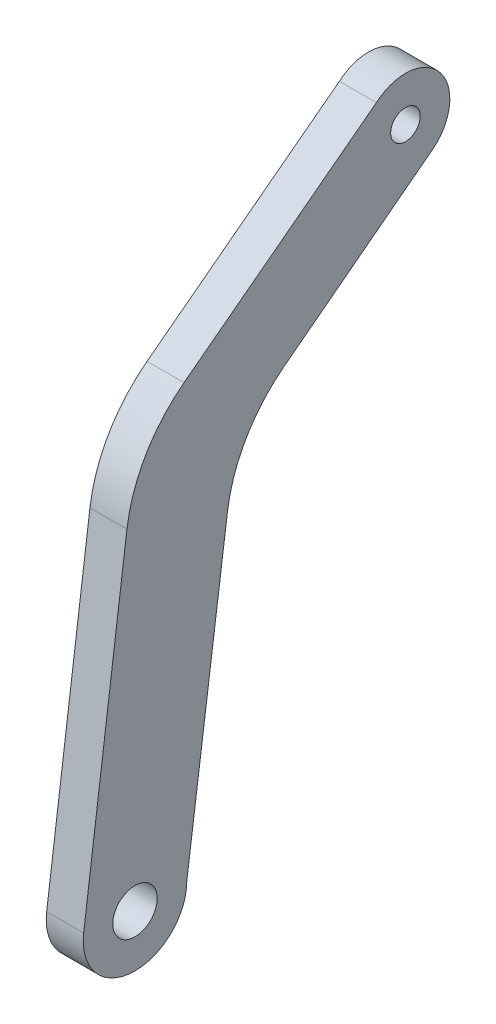
ISO-10303-21;
HEADER;
FILE_DESCRIPTION(('STEP AP214'),'2;1');
FILE_NAME('part.step','',(''),(''),'','','');
FILE_SCHEMA(('AUTOMOTIVE_DESIGN { 1 0 10303 214 1 1 1 1 }'));
ENDSEC;
DATA;
#1=APPLICATION_CONTEXT('core data for automotive mechanical design processes');
#2=APPLICATION_PROTOCOL_DEFINITION('international standard','automotive_design',2000,#1);
#3=PRODUCT_CONTEXT('',#1,'mechanical');
#4=PRODUCT('Part','Part','',(#3));
#5=PRODUCT_RELATED_PRODUCT_CATEGORY('part','',(#4));
#6=PRODUCT_DEFINITION_FORMATION('','',#4);
#7=PRODUCT_DEFINITION_CONTEXT('part definition',#1,'design');
#8=PRODUCT_DEFINITION('design','',#6,#7);
#9=PRODUCT_DEFINITION_SHAPE('','',#8);
#10=(LENGTH_UNIT() NAMED_UNIT(*) SI_UNIT(.MILLI.,.METRE.));
#11=(NAMED_UNIT(*) PLANE_ANGLE_UNIT() SI_UNIT($,.RADIAN.));
#12=(NAMED_UNIT(*) SI_UNIT($,.STERADIAN.) SOLID_ANGLE_UNIT());
#13=UNCERTAINTY_MEASURE_WITH_UNIT(LENGTH_MEASURE(1.E-05),#10,'distance_accuracy_value','');
#14=(GEOMETRIC_REPRESENTATION_CONTEXT(3) GLOBAL_UNCERTAINTY_ASSIGNED_CONTEXT((#13)) GLOBAL_UNIT_ASSIGNED_CONTEXT((#10,
#11,#12)) REPRESENTATION_CONTEXT('',''));
#15=CARTESIAN_POINT('',(0.,0.,0.));
#16=DIRECTION('',(0.,0.,1.));
#17=DIRECTION('',(1.,0.,0.));
#18=AXIS2_PLACEMENT_3D('',#15,#16,#17);
#19=CARTESIAN_POINT('',(5.,-32.6640399264904,0.313917813184128));
#20=DIRECTION('',(1.,0.,0.));
#21=DIRECTION('',(0.,0.,-1.));
#22=AXIS2_PLACEMENT_3D('',#19,#20,#21);
#23=PLANE('',#22);
#24=CARTESIAN_POINT('',(5.,3.32452453756496,-3.92901319278749));
#25=DIRECTION('',(1.,0.,0.));
#26=DIRECTION('',(0.,0.,-1.));
#27=AXIS2_PLACEMENT_3D('',#24,#25,#26);
#28=CIRCLE('',#27,2.00000000000453);
#29=CARTESIAN_POINT('',(5.,3.32452453756496,-5.92901319279202));
#30=VERTEX_POINT('',#29);
#31=EDGE_CURVE('E133',#30,#30,#28,.T.);
#32=ORIENTED_EDGE('',*,*,#31,.F.);
#33=EDGE_LOOP('',(#32));
#34=FACE_BOUND('',#33,.T.);
#35=CARTESIAN_POINT('',(5.,-32.6640399264904,0.313917813184128));
#36=DIRECTION('',(-1.,0.,0.));
#37=DIRECTION('',(0.,0.,-1.));
#38=AXIS2_PLACEMENT_3D('',#35,#36,#37);
#39=CIRCLE('',#38,20.);
#40=CARTESIAN_POINT('',(5.,-29.9728266834477,20.1320249700362));
#41=VERTEX_POINT('',#40);
#42=CARTESIAN_POINT('',(5.,-16.781905188058,12.469484280868));
#43=VERTEX_POINT('',#42);
#44=EDGE_CURVE('E144',#41,#43,#39,.T.);
#45=ORIENTED_EDGE('',*,*,#44,.T.);
#46=DIRECTION('',(0.,0.607778323384194,-0.794106736921617));
#47=VECTOR('',#46,1.);
#48=CARTESIAN_POINT('',(5.,-1.44011588396474,-7.57568313309265));
#49=LINE('',#48,#47);
#50=CARTESIAN_POINT('',(5.,-1.44011588396474,-7.57568313309265));
#51=VERTEX_POINT('',#50);
#52=EDGE_CURVE('E92',#43,#51,#49,.T.);
#53=ORIENTED_EDGE('',*,*,#52,.T.);
#54=CARTESIAN_POINT('',(5.,3.32452453756496,-3.92901319278749));
#55=DIRECTION('',(1.,0.,0.));
#56=DIRECTION('',(0.,0.,-1.));
#57=AXIS2_PLACEMENT_3D('',#54,#55,#56);
#58=CIRCLE('',#57,6.);
#59=CARTESIAN_POINT('',(5.,7.85915300424806,6.24326979004053E-12));
#60=VERTEX_POINT('',#59);
#61=EDGE_CURVE('E159',#51,#60,#58,.T.);
#62=ORIENTED_EDGE('',*,*,#61,.T.);
#63=DIRECTION('',(0.,-0.605436172771901,0.795893862709917));
#64=VECTOR('',#63,1.);
#65=CARTESIAN_POINT('',(5.,7.85915300424806,6.24570068635597E-12));
#66=LINE('',#65,#64);
#67=CARTESIAN_POINT('',(5.,-11.9219663307615,26.0038500907374));
#68=VERTEX_POINT('',#67);
#69=EDGE_CURVE('E172',#60,#68,#66,.T.);
#70=ORIENTED_EDGE('',*,*,#69,.T.);
#71=CARTESIAN_POINT('',(5.,-27.8398435849598,13.8951266352994));
#72=DIRECTION('',(1.,0.,0.));
#73=DIRECTION('',(0.,0.,1.));
#74=AXIS2_PLACEMENT_3D('',#71,#72,#73);
#75=CIRCLE('',#74,20.);
#76=CARTESIAN_POINT('',(5.,-25.2241479210491,33.7233422936434));
#77=VERTEX_POINT('',#76);
#78=EDGE_CURVE('E111',#68,#77,#75,.T.);
#79=ORIENTED_EDGE('',*,*,#78,.T.);
#80=DIRECTION('',(0.,-0.991410782917201,0.130784783195533));
#81=VECTOR('',#80,1.);
#82=CARTESIAN_POINT('',(5.,-25.2241479210491,33.7233422936434));
#83=LINE('',#82,#81);
#84=CARTESIAN_POINT('',(5.,-69.5716897836753,39.5735748588896));
#85=VERTEX_POINT('',#84);
#86=EDGE_CURVE('E105',#77,#85,#83,.T.);
#87=ORIENTED_EDGE('',*,*,#86,.T.);
#88=CARTESIAN_POINT('',(5.,-70.487183266044,32.6336993784692));
#89=DIRECTION('',(1.,0.,0.));
#90=DIRECTION('',(0.,0.,-1.));
#91=AXIS2_PLACEMENT_3D('',#88,#89,#90);
#92=CIRCLE('',#91,7.);
#93=CARTESIAN_POINT('',(5.,-70.487183266044,25.6336993784692));
#94=VERTEX_POINT('',#93);
#95=EDGE_CURVE('E109',#85,#94,#92,.T.);
#96=ORIENTED_EDGE('',*,*,#95,.T.);
#97=DIRECTION('',(0.,0.990905357842604,-0.134560662152132));
#98=VECTOR('',#97,1.);
#99=CARTESIAN_POINT('',(5.,-29.9728266834477,20.1320249700362));
#100=LINE('',#99,#98);
#101=EDGE_CURVE('E49',#94,#41,#100,.T.);
#102=ORIENTED_EDGE('',*,*,#101,.T.);
#103=EDGE_LOOP('',(#45,#53,#62,#70,#79,#87,#96,#102));
#104=FACE_BOUND('',#103,.T.);
#105=CARTESIAN_POINT('',(5.,-70.487183266044,32.6336993784692));
#106=DIRECTION('',(1.,0.,0.));
#107=DIRECTION('',(0.,0.,-1.));
#108=AXIS2_PLACEMENT_3D('',#105,#106,#107);
#109=CIRCLE('',#108,3.0000000000013);
#110=CARTESIAN_POINT('',(5.,-70.487183266044,29.6336993784679));
#111=VERTEX_POINT('',#110);
#112=EDGE_CURVE('E181',#111,#111,#109,.T.);
#113=ORIENTED_EDGE('',*,*,#112,.F.);
#114=EDGE_LOOP('',(#113));
#115=FACE_BOUND('',#114,.T.);
#116=ADVANCED_FACE('F32',(#34,#104,#115),#23,.T.);
#117=CARTESIAN_POINT('',(0.,-32.6640399264904,0.313917813184128));
#118=DIRECTION('',(1.,0.,0.));
#119=DIRECTION('',(0.,0.,-1.));
#120=AXIS2_PLACEMENT_3D('',#117,#118,#119);
#121=PLANE('',#120);
#122=CARTESIAN_POINT('',(0.,3.32452453756496,-3.92901319278749));
#123=DIRECTION('',(1.,0.,0.));
#124=DIRECTION('',(0.,0.,-1.));
#125=AXIS2_PLACEMENT_3D('',#122,#123,#124);
#126=CIRCLE('',#125,2.00000000000453);
#127=CARTESIAN_POINT('',(0.,3.32452453756496,-5.92901319279202));
#128=VERTEX_POINT('',#127);
#129=EDGE_CURVE('E178',#128,#128,#126,.T.);
#130=ORIENTED_EDGE('',*,*,#129,.T.);
#131=EDGE_LOOP('',(#130));
#132=FACE_BOUND('',#131,.T.);
#133=CARTESIAN_POINT('',(0.,-32.6640399264904,0.313917813184128));
#134=DIRECTION('',(-1.,0.,0.));
#135=DIRECTION('',(0.,0.,-1.));
#136=AXIS2_PLACEMENT_3D('',#133,#134,#135);
#137=CIRCLE('',#136,20.);
#138=CARTESIAN_POINT('',(0.,-29.9728266834477,20.1320249700362));
#139=VERTEX_POINT('',#138);
#140=CARTESIAN_POINT('',(0.,-16.781905188058,12.469484280868));
#141=VERTEX_POINT('',#140);
#142=EDGE_CURVE('E129',#139,#141,#137,.T.);
#143=ORIENTED_EDGE('',*,*,#142,.F.);
#144=DIRECTION('',(0.,0.990905357842604,-0.134560662152132));
#145=VECTOR('',#144,1.);
#146=CARTESIAN_POINT('',(0.,-29.9728266834477,20.1320249700362));
#147=LINE('',#146,#145);
#148=CARTESIAN_POINT('',(0.,-70.487183266044,25.6336993784692));
#149=VERTEX_POINT('',#148);
#150=EDGE_CURVE('E84',#149,#139,#147,.T.);
#151=ORIENTED_EDGE('',*,*,#150,.F.);
#152=CARTESIAN_POINT('',(0.,-70.487183266044,32.6336993784692));
#153=DIRECTION('',(1.,0.,0.));
#154=DIRECTION('',(0.,0.,-1.));
#155=AXIS2_PLACEMENT_3D('',#152,#153,#154);
#156=CIRCLE('',#155,7.);
#157=CARTESIAN_POINT('',(0.,-69.5716897836753,39.5735748588896));
#158=VERTEX_POINT('',#157);
#159=EDGE_CURVE('E78',#158,#149,#156,.T.);
#160=ORIENTED_EDGE('',*,*,#159,.F.);
#161=DIRECTION('',(0.,-0.991410782917201,0.130784783195533));
#162=VECTOR('',#161,1.);
#163=CARTESIAN_POINT('',(0.,-25.2241479210491,33.7233422936434));
#164=LINE('',#163,#162);
#165=CARTESIAN_POINT('',(0.,-25.2241479210491,33.7233422936434));
#166=VERTEX_POINT('',#165);
#167=EDGE_CURVE('E119',#166,#158,#164,.T.);
#168=ORIENTED_EDGE('',*,*,#167,.F.);
#169=CARTESIAN_POINT('',(0.,-27.8398435849598,13.8951266352994));
#170=DIRECTION('',(1.,0.,0.));
#171=DIRECTION('',(0.,0.,1.));
#172=AXIS2_PLACEMENT_3D('',#169,#170,#171);
#173=CIRCLE('',#172,20.);
#174=CARTESIAN_POINT('',(0.,-11.9219663307615,26.0038500907374));
#175=VERTEX_POINT('',#174);
#176=EDGE_CURVE('E139',#175,#166,#173,.T.);
#177=ORIENTED_EDGE('',*,*,#176,.F.);
#178=DIRECTION('',(0.,-0.605436172771901,0.795893862709917));
#179=VECTOR('',#178,1.);
#180=CARTESIAN_POINT('',(0.,7.85915300424806,6.24570068635597E-12));
#181=LINE('',#180,#179);
#182=CARTESIAN_POINT('',(0.,7.85915300424806,6.24326979004053E-12));
#183=VERTEX_POINT('',#182);
#184=EDGE_CURVE('E137',#183,#175,#181,.T.);
#185=ORIENTED_EDGE('',*,*,#184,.F.);
#186=CARTESIAN_POINT('',(0.,3.32452453756496,-3.92901319278749));
#187=DIRECTION('',(1.,0.,0.));
#188=DIRECTION('',(0.,0.,-1.));
#189=AXIS2_PLACEMENT_3D('',#186,#187,#188);
#190=CIRCLE('',#189,6.);
#191=CARTESIAN_POINT('',(0.,-1.44011588396474,-7.57568313309265));
#192=VERTEX_POINT('',#191);
#193=EDGE_CURVE('E135',#192,#183,#190,.T.);
#194=ORIENTED_EDGE('',*,*,#193,.F.);
#195=DIRECTION('',(0.,0.607778323384194,-0.794106736921617));
#196=VECTOR('',#195,1.);
#197=CARTESIAN_POINT('',(0.,-1.44011588396474,-7.57568313309265));
#198=LINE('',#197,#196);
#199=EDGE_CURVE('E132',#141,#192,#198,.T.);
#200=ORIENTED_EDGE('',*,*,#199,.F.);
#201=EDGE_LOOP('',(#143,#151,#160,#168,#177,#185,#194,#200));
#202=FACE_BOUND('',#201,.T.);
#203=CARTESIAN_POINT('',(0.,-70.487183266044,32.6336993784692));
#204=DIRECTION('',(1.,0.,0.));
#205=DIRECTION('',(0.,0.,-1.));
#206=AXIS2_PLACEMENT_3D('',#203,#204,#205);
#207=CIRCLE('',#206,3.0000000000013);
#208=CARTESIAN_POINT('',(0.,-70.487183266044,29.6336993784679));
#209=VERTEX_POINT('',#208);
#210=EDGE_CURVE('E184',#209,#209,#207,.T.);
#211=ORIENTED_EDGE('',*,*,#210,.T.);
#212=EDGE_LOOP('',(#211));
#213=FACE_BOUND('',#212,.T.);
#214=ADVANCED_FACE('F163',(#132,#202,#213),#121,.F.);
#215=CARTESIAN_POINT('',(5.,-32.6640399264904,0.313917813184128));
#216=DIRECTION('',(-1.,0.,0.));
#217=DIRECTION('',(0.,0.,1.));
#218=AXIS2_PLACEMENT_3D('',#215,#216,#217);
#219=CYLINDRICAL_SURFACE('',#218,20.);
#220=ORIENTED_EDGE('',*,*,#142,.T.);
#221=DIRECTION('',(-1.,0.,0.));
#222=VECTOR('',#221,1.);
#223=CARTESIAN_POINT('',(5.,-16.781905188058,12.469484280868));
#224=LINE('',#223,#222);
#225=EDGE_CURVE('E11',#43,#141,#224,.T.);
#226=ORIENTED_EDGE('',*,*,#225,.F.);
#227=ORIENTED_EDGE('',*,*,#44,.F.);
#228=DIRECTION('',(-1.,0.,0.));
#229=VECTOR('',#228,1.);
#230=CARTESIAN_POINT('',(5.,-29.9728266834477,20.1320249700362));
#231=LINE('',#230,#229);
#232=EDGE_CURVE('E125',#41,#139,#231,.T.);
#233=ORIENTED_EDGE('',*,*,#232,.T.);
#234=EDGE_LOOP('',(#220,#226,#227,#233));
#235=FACE_BOUND('',#234,.T.);
#236=ADVANCED_FACE('F34',(#235),#219,.F.);
#237=CARTESIAN_POINT('',(5.,-1.44011588396474,-7.57568313309265));
#238=DIRECTION('',(0.,0.794106736921617,0.607778323384194));
#239=DIRECTION('',(0.,-0.607778323384194,0.794106736921617));
#240=AXIS2_PLACEMENT_3D('',#237,#238,#239);
#241=PLANE('',#240);
#242=ORIENTED_EDGE('',*,*,#199,.T.);
#243=DIRECTION('',(-1.,0.,0.));
#244=VECTOR('',#243,1.);
#245=CARTESIAN_POINT('',(5.,-1.44011588396474,-7.57568313309265));
#246=LINE('',#245,#244);
#247=EDGE_CURVE('E41',#51,#192,#246,.T.);
#248=ORIENTED_EDGE('',*,*,#247,.F.);
#249=ORIENTED_EDGE('',*,*,#52,.F.);
#250=ORIENTED_EDGE('',*,*,#225,.T.);
#251=EDGE_LOOP('',(#242,#248,#249,#250));
#252=FACE_BOUND('',#251,.T.);
#253=ADVANCED_FACE('F217',(#252),#241,.F.);
#254=CARTESIAN_POINT('',(5.,3.32452453756496,-3.92901319278749));
#255=DIRECTION('',(-1.,0.,0.));
#256=DIRECTION('',(0.,0.,1.));
#257=AXIS2_PLACEMENT_3D('',#254,#255,#256);
#258=CYLINDRICAL_SURFACE('',#257,6.);
#259=ORIENTED_EDGE('',*,*,#193,.T.);
#260=DIRECTION('',(-1.,0.,0.));
#261=VECTOR('',#260,1.);
#262=CARTESIAN_POINT('',(5.,7.85915300424806,6.24326979004053E-12));
#263=LINE('',#262,#261);
#264=EDGE_CURVE('E151',#60,#183,#263,.T.);
#265=ORIENTED_EDGE('',*,*,#264,.F.);
#266=ORIENTED_EDGE('',*,*,#61,.F.);
#267=ORIENTED_EDGE('',*,*,#247,.T.);
#268=EDGE_LOOP('',(#259,#265,#266,#267));
#269=FACE_BOUND('',#268,.T.);
#270=ADVANCED_FACE('F157',(#269),#258,.T.);
#271=CARTESIAN_POINT('',(5.,7.85915300424806,6.24570068635597E-12));
#272=DIRECTION('',(0.,-0.795893862709917,-0.605436172771901));
#273=DIRECTION('',(0.,0.605436172771901,-0.795893862709917));
#274=AXIS2_PLACEMENT_3D('',#271,#272,#273);
#275=PLANE('',#274);
#276=ORIENTED_EDGE('',*,*,#184,.T.);
#277=DIRECTION('',(-1.,0.,0.));
#278=VECTOR('',#277,1.);
#279=CARTESIAN_POINT('',(5.,-11.9219663307615,26.0038500907374));
#280=LINE('',#279,#278);
#281=EDGE_CURVE('E148',#68,#175,#280,.T.);
#282=ORIENTED_EDGE('',*,*,#281,.F.);
#283=ORIENTED_EDGE('',*,*,#69,.F.);
#284=ORIENTED_EDGE('',*,*,#264,.T.);
#285=EDGE_LOOP('',(#276,#282,#283,#284));
#286=FACE_BOUND('',#285,.T.);
#287=ADVANCED_FACE('F168',(#286),#275,.F.);
#288=CARTESIAN_POINT('',(5.,-27.8398435849598,13.8951266352994));
#289=DIRECTION('',(-1.,0.,0.));
#290=DIRECTION('',(0.,0.,1.));
#291=AXIS2_PLACEMENT_3D('',#288,#289,#290);
#292=CYLINDRICAL_SURFACE('',#291,20.);
#293=ORIENTED_EDGE('',*,*,#176,.T.);
#294=DIRECTION('',(-1.,0.,0.));
#295=VECTOR('',#294,1.);
#296=CARTESIAN_POINT('',(5.,-25.2241479210491,33.7233422936434));
#297=LINE('',#296,#295);
#298=EDGE_CURVE('E120',#77,#166,#297,.T.);
#299=ORIENTED_EDGE('',*,*,#298,.F.);
#300=ORIENTED_EDGE('',*,*,#78,.F.);
#301=ORIENTED_EDGE('',*,*,#281,.T.);
#302=EDGE_LOOP('',(#293,#299,#300,#301));
#303=FACE_BOUND('',#302,.T.);
#304=ADVANCED_FACE('F171',(#303),#292,.T.);
#305=CARTESIAN_POINT('',(5.,-25.2241479210491,33.7233422936434));
#306=DIRECTION('',(0.,-0.130784783195533,-0.991410782917201));
#307=DIRECTION('',(0.,0.991410782917201,-0.130784783195533));
#308=AXIS2_PLACEMENT_3D('',#305,#306,#307);
#309=PLANE('',#308);
#310=ORIENTED_EDGE('',*,*,#167,.T.);
#311=DIRECTION('',(-1.,0.,0.));
#312=VECTOR('',#311,1.);
#313=CARTESIAN_POINT('',(5.,-69.5716897836753,39.5735748588896));
#314=LINE('',#313,#312);
#315=EDGE_CURVE('E116',#85,#158,#314,.T.);
#316=ORIENTED_EDGE('',*,*,#315,.F.);
#317=ORIENTED_EDGE('',*,*,#86,.F.);
#318=ORIENTED_EDGE('',*,*,#298,.T.);
#319=EDGE_LOOP('',(#310,#316,#317,#318));
#320=FACE_BOUND('',#319,.T.);
#321=ADVANCED_FACE('F117',(#320),#309,.F.);
#322=CARTESIAN_POINT('',(5.,-70.487183266044,32.6336993784692));
#323=DIRECTION('',(-1.,0.,0.));
#324=DIRECTION('',(0.,0.,1.));
#325=AXIS2_PLACEMENT_3D('',#322,#323,#324);
#326=CYLINDRICAL_SURFACE('',#325,7.);
#327=ORIENTED_EDGE('',*,*,#159,.T.);
#328=DIRECTION('',(-1.,0.,0.));
#329=VECTOR('',#328,1.);
#330=CARTESIAN_POINT('',(5.,-70.487183266044,25.6336993784692));
#331=LINE('',#330,#329);
#332=EDGE_CURVE('E121',#94,#149,#331,.T.);
#333=ORIENTED_EDGE('',*,*,#332,.F.);
#334=ORIENTED_EDGE('',*,*,#95,.F.);
#335=ORIENTED_EDGE('',*,*,#315,.T.);
#336=EDGE_LOOP('',(#327,#333,#334,#335));
#337=FACE_BOUND('',#336,.T.);
#338=ADVANCED_FACE('F123',(#337),#326,.T.);
#339=CARTESIAN_POINT('',(5.,-29.9728266834477,20.1320249700362));
#340=DIRECTION('',(0.,0.134560662152132,0.990905357842604));
#341=DIRECTION('',(0.,-0.990905357842604,0.134560662152132));
#342=AXIS2_PLACEMENT_3D('',#339,#340,#341);
#343=PLANE('',#342);
#344=ORIENTED_EDGE('',*,*,#150,.T.);
#345=ORIENTED_EDGE('',*,*,#232,.F.);
#346=ORIENTED_EDGE('',*,*,#101,.F.);
#347=ORIENTED_EDGE('',*,*,#332,.T.);
#348=EDGE_LOOP('',(#344,#345,#346,#347));
#349=FACE_BOUND('',#348,.T.);
#350=ADVANCED_FACE('F205',(#349),#343,.F.);
#351=CARTESIAN_POINT('',(5.,3.32452453756496,-3.92901319278749));
#352=DIRECTION('',(-1.,0.,0.));
#353=DIRECTION('',(0.,0.,1.));
#354=AXIS2_PLACEMENT_3D('',#351,#352,#353);
#355=CYLINDRICAL_SURFACE('',#354,2.00000000000453);
#356=ORIENTED_EDGE('',*,*,#31,.T.);
#357=EDGE_LOOP('',(#356));
#358=FACE_BOUND('',#357,.T.);
#359=ORIENTED_EDGE('',*,*,#129,.F.);
#360=EDGE_LOOP('',(#359));
#361=FACE_BOUND('',#360,.T.);
#362=ADVANCED_FACE('F202',(#358,#361),#355,.F.);
#363=CARTESIAN_POINT('',(5.,-70.487183266044,32.6336993784692));
#364=DIRECTION('',(-1.,0.,0.));
#365=DIRECTION('',(0.,0.,1.));
#366=AXIS2_PLACEMENT_3D('',#363,#364,#365);
#367=CYLINDRICAL_SURFACE('',#366,3.0000000000013);
#368=ORIENTED_EDGE('',*,*,#112,.T.);
#369=EDGE_LOOP('',(#368));
#370=FACE_BOUND('',#369,.T.);
#371=ORIENTED_EDGE('',*,*,#210,.F.);
#372=EDGE_LOOP('',(#371));
#373=FACE_BOUND('',#372,.T.);
#374=ADVANCED_FACE('F190',(#370,#373),#367,.F.);
#375=CLOSED_SHELL('',(#116,#214,#236,#253,#270,#287,#304,#321,#338,#350,#362,#374));
#376=MANIFOLD_SOLID_BREP('B2',#375);
#377=ADVANCED_BREP_SHAPE_REPRESENTATION('',(#18,#376),#14);
#378=SHAPE_DEFINITION_REPRESENTATION(#9,#377);
ENDSEC;
END-ISO-10303-21;
